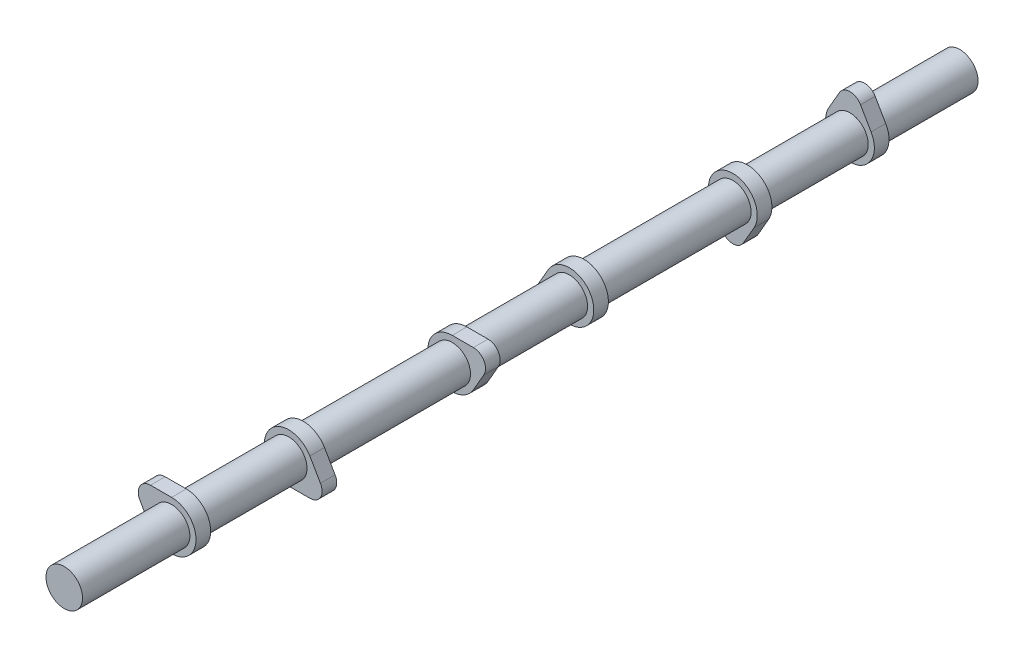
ISO-10303-21;
HEADER;
FILE_DESCRIPTION(('STEP AP214'),'2;1');
FILE_NAME('part.step','',(''),(''),'','','');
FILE_SCHEMA(('AUTOMOTIVE_DESIGN { 1 0 10303 214 1 1 1 1 }'));
ENDSEC;
DATA;
#1=APPLICATION_CONTEXT('core data for automotive mechanical design processes');
#2=APPLICATION_PROTOCOL_DEFINITION('international standard','automotive_design',2000,#1);
#3=PRODUCT_CONTEXT('',#1,'mechanical');
#4=PRODUCT('Part','Part','',(#3));
#5=PRODUCT_RELATED_PRODUCT_CATEGORY('part','',(#4));
#6=PRODUCT_DEFINITION_FORMATION('','',#4);
#7=PRODUCT_DEFINITION_CONTEXT('part definition',#1,'design');
#8=PRODUCT_DEFINITION('design','',#6,#7);
#9=PRODUCT_DEFINITION_SHAPE('','',#8);
#10=(LENGTH_UNIT() NAMED_UNIT(*) SI_UNIT(.MILLI.,.METRE.));
#11=(NAMED_UNIT(*) PLANE_ANGLE_UNIT() SI_UNIT($,.RADIAN.));
#12=(NAMED_UNIT(*) SI_UNIT($,.STERADIAN.) SOLID_ANGLE_UNIT());
#13=UNCERTAINTY_MEASURE_WITH_UNIT(LENGTH_MEASURE(1.E-05),#10,'distance_accuracy_value','');
#14=(GEOMETRIC_REPRESENTATION_CONTEXT(3) GLOBAL_UNCERTAINTY_ASSIGNED_CONTEXT((#13)) GLOBAL_UNIT_ASSIGNED_CONTEXT((#10,
#11,#12)) REPRESENTATION_CONTEXT('',''));
#15=CARTESIAN_POINT('',(0.,0.,0.));
#16=DIRECTION('',(0.,0.,1.));
#17=DIRECTION('',(1.,0.,0.));
#18=AXIS2_PLACEMENT_3D('',#15,#16,#17);
#19=CARTESIAN_POINT('',(0.,0.,412.75));
#20=DIRECTION('',(0.,0.,-1.));
#21=DIRECTION('',(-1.,0.,0.));
#22=AXIS2_PLACEMENT_3D('',#19,#20,#21);
#23=CYLINDRICAL_SURFACE('',#22,9.5);
#24=CARTESIAN_POINT('',(0.,0.,210.82));
#25=DIRECTION('',(0.,0.,1.));
#26=DIRECTION('',(1.,0.,0.));
#27=AXIS2_PLACEMENT_3D('',#24,#25,#26);
#28=CIRCLE('',#27,9.5);
#29=CARTESIAN_POINT('',(9.5,0.,210.82));
#30=VERTEX_POINT('',#29);
#31=EDGE_CURVE('E410',#30,#30,#28,.F.);
#32=ORIENTED_EDGE('',*,*,#31,.F.);
#33=EDGE_LOOP('',(#32));
#34=FACE_BOUND('',#33,.T.);
#35=CARTESIAN_POINT('',(0.,0.,288.29));
#36=DIRECTION('',(0.,0.,1.));
#37=DIRECTION('',(1.,0.,0.));
#38=AXIS2_PLACEMENT_3D('',#35,#36,#37);
#39=CIRCLE('',#38,9.5);
#40=CARTESIAN_POINT('',(9.5,0.,288.29));
#41=VERTEX_POINT('',#40);
#42=EDGE_CURVE('E236',#41,#41,#39,.F.);
#43=ORIENTED_EDGE('',*,*,#42,.T.);
#44=EDGE_LOOP('',(#43));
#45=FACE_BOUND('',#44,.T.);
#46=ADVANCED_FACE('F39',(#34,#45),#23,.T.);
#47=CARTESIAN_POINT('',(0.,0.,149.86));
#48=DIRECTION('',(0.,0.,1.));
#49=DIRECTION('',(1.,0.,0.));
#50=AXIS2_PLACEMENT_3D('',#47,#48,#49);
#51=CIRCLE('',#50,9.5);
#52=CARTESIAN_POINT('',(9.5,0.,149.86));
#53=VERTEX_POINT('',#52);
#54=EDGE_CURVE('E405',#53,#53,#51,.F.);
#55=ORIENTED_EDGE('',*,*,#54,.F.);
#56=EDGE_LOOP('',(#55));
#57=FACE_BOUND('',#56,.T.);
#58=CARTESIAN_POINT('',(0.,0.,203.2));
#59=DIRECTION('',(0.,0.,1.));
#60=DIRECTION('',(1.,0.,0.));
#61=AXIS2_PLACEMENT_3D('',#58,#59,#60);
#62=CIRCLE('',#61,9.5);
#63=CARTESIAN_POINT('',(9.5,0.,203.2));
#64=VERTEX_POINT('',#63);
#65=EDGE_CURVE('E304',#64,#64,#62,.F.);
#66=ORIENTED_EDGE('',*,*,#65,.T.);
#67=EDGE_LOOP('',(#66));
#68=FACE_BOUND('',#67,.T.);
#69=ADVANCED_FACE('F442',(#57,#68),#23,.T.);
#70=CARTESIAN_POINT('',(0.,0.,64.77));
#71=DIRECTION('',(0.,0.,1.));
#72=DIRECTION('',(1.,0.,0.));
#73=AXIS2_PLACEMENT_3D('',#70,#71,#72);
#74=CIRCLE('',#73,9.5);
#75=CARTESIAN_POINT('',(9.5,0.,64.77));
#76=VERTEX_POINT('',#75);
#77=EDGE_CURVE('E377',#76,#76,#74,.F.);
#78=ORIENTED_EDGE('',*,*,#77,.F.);
#79=EDGE_LOOP('',(#78));
#80=FACE_BOUND('',#79,.T.);
#81=CARTESIAN_POINT('',(0.,0.,142.24));
#82=DIRECTION('',(0.,0.,1.));
#83=DIRECTION('',(1.,0.,0.));
#84=AXIS2_PLACEMENT_3D('',#81,#82,#83);
#85=CIRCLE('',#84,9.5);
#86=CARTESIAN_POINT('',(9.5,0.,142.24));
#87=VERTEX_POINT('',#86);
#88=EDGE_CURVE('E335',#87,#87,#85,.F.);
#89=ORIENTED_EDGE('',*,*,#88,.T.);
#90=EDGE_LOOP('',(#89));
#91=FACE_BOUND('',#90,.T.);
#92=ADVANCED_FACE('F448',(#80,#91),#23,.T.);
#93=CARTESIAN_POINT('',(0.,0.,3.80999999999998));
#94=DIRECTION('',(0.,0.,1.));
#95=DIRECTION('',(1.,0.,0.));
#96=AXIS2_PLACEMENT_3D('',#93,#94,#95);
#97=CIRCLE('',#96,9.5);
#98=CARTESIAN_POINT('',(9.5,0.,3.80999999999998));
#99=VERTEX_POINT('',#98);
#100=EDGE_CURVE('E374',#99,#99,#97,.T.);
#101=ORIENTED_EDGE('',*,*,#100,.T.);
#102=EDGE_LOOP('',(#101));
#103=FACE_BOUND('',#102,.T.);
#104=CARTESIAN_POINT('',(0.,0.,57.15));
#105=DIRECTION('',(0.,0.,1.));
#106=DIRECTION('',(1.,0.,0.));
#107=AXIS2_PLACEMENT_3D('',#104,#105,#106);
#108=CIRCLE('',#107,9.5);
#109=CARTESIAN_POINT('',(9.5,0.,57.15));
#110=VERTEX_POINT('',#109);
#111=EDGE_CURVE('E366',#110,#110,#108,.F.);
#112=ORIENTED_EDGE('',*,*,#111,.T.);
#113=EDGE_LOOP('',(#112));
#114=FACE_BOUND('',#113,.T.);
#115=ADVANCED_FACE('F573',(#103,#114),#23,.T.);
#116=CARTESIAN_POINT('',(0.,12.7,3.81));
#117=DIRECTION('',(0.,0.,-1.));
#118=DIRECTION('',(-1.,0.,0.));
#119=AXIS2_PLACEMENT_3D('',#116,#117,#118);
#120=CYLINDRICAL_SURFACE('',#119,6.35);
#121=CARTESIAN_POINT('',(0.,12.7,-3.81));
#122=DIRECTION('',(0.,0.,1.));
#123=DIRECTION('',(1.,0.,0.));
#124=AXIS2_PLACEMENT_3D('',#121,#122,#123);
#125=CIRCLE('',#124,6.35);
#126=CARTESIAN_POINT('',(5.49926131403118,15.875,-3.81));
#127=VERTEX_POINT('',#126);
#128=CARTESIAN_POINT('',(-5.49926131403119,15.875,-3.81));
#129=VERTEX_POINT('',#128);
#130=EDGE_CURVE('E386',#127,#129,#125,.T.);
#131=ORIENTED_EDGE('',*,*,#130,.T.);
#132=DIRECTION('',(0.,0.,-1.));
#133=VECTOR('',#132,1.);
#134=CARTESIAN_POINT('',(-5.49926131403119,15.875,3.81));
#135=LINE('',#134,#133);
#136=CARTESIAN_POINT('',(-5.49926131403119,15.875,3.81));
#137=VERTEX_POINT('',#136);
#138=EDGE_CURVE('E378',#137,#129,#135,.T.);
#139=ORIENTED_EDGE('',*,*,#138,.F.);
#140=CARTESIAN_POINT('',(0.,12.7,3.81));
#141=DIRECTION('',(0.,0.,1.));
#142=DIRECTION('',(1.,0.,0.));
#143=AXIS2_PLACEMENT_3D('',#140,#141,#142);
#144=CIRCLE('',#143,6.35);
#145=CARTESIAN_POINT('',(5.49926131403118,15.875,3.81));
#146=VERTEX_POINT('',#145);
#147=EDGE_CURVE('E379',#146,#137,#144,.T.);
#148=ORIENTED_EDGE('',*,*,#147,.F.);
#149=DIRECTION('',(0.,0.,-1.));
#150=VECTOR('',#149,1.);
#151=CARTESIAN_POINT('',(5.49926131403118,15.875,3.81));
#152=LINE('',#151,#150);
#153=EDGE_CURVE('E385',#146,#127,#152,.T.);
#154=ORIENTED_EDGE('',*,*,#153,.T.);
#155=EDGE_LOOP('',(#131,#139,#148,#154));
#156=FACE_BOUND('',#155,.T.);
#157=ADVANCED_FACE('F41',(#156),#120,.T.);
#158=CARTESIAN_POINT('',(-5.49926131403119,15.875,3.81));
#159=DIRECTION('',(0.866025403784439,-0.5,0.));
#160=DIRECTION('',(0.5,0.866025403784439,0.));
#161=AXIS2_PLACEMENT_3D('',#158,#159,#160);
#162=PLANE('',#161);
#163=DIRECTION('',(-0.5,-0.866025403784439,0.));
#164=VECTOR('',#163,1.);
#165=CARTESIAN_POINT('',(-5.49926131403119,15.875,-3.81));
#166=LINE('',#165,#164);
#167=CARTESIAN_POINT('',(-10.9985226280624,6.35,-3.81));
#168=VERTEX_POINT('',#167);
#169=EDGE_CURVE('E389',#129,#168,#166,.T.);
#170=ORIENTED_EDGE('',*,*,#169,.T.);
#171=DIRECTION('',(0.,0.,-1.));
#172=VECTOR('',#171,1.);
#173=CARTESIAN_POINT('',(-10.9985226280624,6.35,3.81));
#174=LINE('',#173,#172);
#175=CARTESIAN_POINT('',(-10.9985226280624,6.35,3.81));
#176=VERTEX_POINT('',#175);
#177=EDGE_CURVE('E396',#176,#168,#174,.T.);
#178=ORIENTED_EDGE('',*,*,#177,.F.);
#179=DIRECTION('',(-0.5,-0.866025403784439,0.));
#180=VECTOR('',#179,1.);
#181=CARTESIAN_POINT('',(-5.49926131403119,15.875,3.81));
#182=LINE('',#181,#180);
#183=EDGE_CURVE('E88',#137,#176,#182,.T.);
#184=ORIENTED_EDGE('',*,*,#183,.F.);
#185=ORIENTED_EDGE('',*,*,#138,.T.);
#186=EDGE_LOOP('',(#170,#178,#184,#185));
#187=FACE_BOUND('',#186,.T.);
#188=ADVANCED_FACE('F599',(#187),#162,.F.);
#189=CARTESIAN_POINT('',(0.,0.,3.81));
#190=DIRECTION('',(0.,0.,-1.));
#191=DIRECTION('',(-1.,0.,0.));
#192=AXIS2_PLACEMENT_3D('',#189,#190,#191);
#193=CYLINDRICAL_SURFACE('',#192,12.7);
#194=CARTESIAN_POINT('',(0.,0.,-3.81));
#195=DIRECTION('',(0.,0.,1.));
#196=DIRECTION('',(1.,0.,0.));
#197=AXIS2_PLACEMENT_3D('',#194,#195,#196);
#198=CIRCLE('',#197,12.7);
#199=CARTESIAN_POINT('',(10.9985226280624,6.35,-3.81));
#200=VERTEX_POINT('',#199);
#201=EDGE_CURVE('E74',#168,#200,#198,.T.);
#202=ORIENTED_EDGE('',*,*,#201,.T.);
#203=DIRECTION('',(0.,0.,-1.));
#204=VECTOR('',#203,1.);
#205=CARTESIAN_POINT('',(10.9985226280624,6.35,3.81));
#206=LINE('',#205,#204);
#207=CARTESIAN_POINT('',(10.9985226280624,6.35,3.81));
#208=VERTEX_POINT('',#207);
#209=EDGE_CURVE('E394',#208,#200,#206,.T.);
#210=ORIENTED_EDGE('',*,*,#209,.F.);
#211=CARTESIAN_POINT('',(0.,0.,3.81));
#212=DIRECTION('',(0.,0.,1.));
#213=DIRECTION('',(1.,0.,0.));
#214=AXIS2_PLACEMENT_3D('',#211,#212,#213);
#215=CIRCLE('',#214,12.7);
#216=EDGE_CURVE('E382',#176,#208,#215,.T.);
#217=ORIENTED_EDGE('',*,*,#216,.F.);
#218=ORIENTED_EDGE('',*,*,#177,.T.);
#219=EDGE_LOOP('',(#202,#210,#217,#218));
#220=FACE_BOUND('',#219,.T.);
#221=ADVANCED_FACE('F614',(#220),#193,.T.);
#222=CARTESIAN_POINT('',(5.49926131403118,15.875,3.81));
#223=DIRECTION('',(-0.866025403784438,-0.5,0.));
#224=DIRECTION('',(0.5,-0.866025403784439,0.));
#225=AXIS2_PLACEMENT_3D('',#222,#223,#224);
#226=PLANE('',#225);
#227=DIRECTION('',(-0.5,0.866025403784439,0.));
#228=VECTOR('',#227,1.);
#229=CARTESIAN_POINT('',(5.49926131403118,15.875,-3.81));
#230=LINE('',#229,#228);
#231=EDGE_CURVE('E80',#200,#127,#230,.T.);
#232=ORIENTED_EDGE('',*,*,#231,.T.);
#233=ORIENTED_EDGE('',*,*,#153,.F.);
#234=DIRECTION('',(-0.5,0.866025403784439,0.));
#235=VECTOR('',#234,1.);
#236=CARTESIAN_POINT('',(5.49926131403118,15.875,3.81));
#237=LINE('',#236,#235);
#238=EDGE_CURVE('E56',#208,#146,#237,.T.);
#239=ORIENTED_EDGE('',*,*,#238,.F.);
#240=ORIENTED_EDGE('',*,*,#209,.T.);
#241=EDGE_LOOP('',(#232,#233,#239,#240));
#242=FACE_BOUND('',#241,.T.);
#243=ADVANCED_FACE('F608',(#242),#226,.F.);
#244=CARTESIAN_POINT('',(0.,12.7,3.81));
#245=DIRECTION('',(0.,0.,1.));
#246=DIRECTION('',(1.,0.,0.));
#247=AXIS2_PLACEMENT_3D('',#244,#245,#246);
#248=PLANE('',#247);
#249=ORIENTED_EDGE('',*,*,#100,.F.);
#250=EDGE_LOOP('',(#249));
#251=FACE_BOUND('',#250,.T.);
#252=ORIENTED_EDGE('',*,*,#147,.T.);
#253=ORIENTED_EDGE('',*,*,#183,.T.);
#254=ORIENTED_EDGE('',*,*,#216,.T.);
#255=ORIENTED_EDGE('',*,*,#238,.T.);
#256=EDGE_LOOP('',(#252,#253,#254,#255));
#257=FACE_BOUND('',#256,.T.);
#258=ADVANCED_FACE('F606',(#251,#257),#248,.T.);
#259=CARTESIAN_POINT('',(0.,12.7,-3.81));
#260=DIRECTION('',(0.,0.,1.));
#261=DIRECTION('',(1.,0.,0.));
#262=AXIS2_PLACEMENT_3D('',#259,#260,#261);
#263=PLANE('',#262);
#264=CARTESIAN_POINT('',(0.,0.,-3.80999999999998));
#265=DIRECTION('',(0.,0.,1.));
#266=DIRECTION('',(1.,0.,0.));
#267=AXIS2_PLACEMENT_3D('',#264,#265,#266);
#268=CIRCLE('',#267,9.5);
#269=CARTESIAN_POINT('',(9.5,0.,-3.80999999999998));
#270=VERTEX_POINT('',#269);
#271=EDGE_CURVE('E370',#270,#270,#268,.T.);
#272=ORIENTED_EDGE('',*,*,#271,.T.);
#273=EDGE_LOOP('',(#272));
#274=FACE_BOUND('',#273,.T.);
#275=ORIENTED_EDGE('',*,*,#130,.F.);
#276=ORIENTED_EDGE('',*,*,#231,.F.);
#277=ORIENTED_EDGE('',*,*,#201,.F.);
#278=ORIENTED_EDGE('',*,*,#169,.F.);
#279=EDGE_LOOP('',(#275,#276,#277,#278));
#280=FACE_BOUND('',#279,.T.);
#281=ADVANCED_FACE('F589',(#274,#280),#263,.F.);
#282=CARTESIAN_POINT('',(0.,0.,-53.34));
#283=DIRECTION('',(0.,0.,-1.));
#284=DIRECTION('',(-1.,0.,0.));
#285=AXIS2_PLACEMENT_3D('',#282,#283,#284);
#286=PLANE('',#285);
#287=CARTESIAN_POINT('',(0.,0.,-53.34));
#288=DIRECTION('',(0.,0.,-1.));
#289=DIRECTION('',(-1.,0.,0.));
#290=AXIS2_PLACEMENT_3D('',#287,#288,#289);
#291=CIRCLE('',#290,9.5);
#292=CARTESIAN_POINT('',(-9.5,0.,-53.34));
#293=VERTEX_POINT('',#292);
#294=EDGE_CURVE('E371',#293,#293,#291,.T.);
#295=ORIENTED_EDGE('',*,*,#294,.T.);
#296=EDGE_LOOP('',(#295));
#297=FACE_BOUND('',#296,.T.);
#298=ADVANCED_FACE('F571',(#297),#286,.T.);
#299=ORIENTED_EDGE('',*,*,#294,.F.);
#300=EDGE_LOOP('',(#299));
#301=FACE_BOUND('',#300,.T.);
#302=ORIENTED_EDGE('',*,*,#271,.F.);
#303=EDGE_LOOP('',(#302));
#304=FACE_BOUND('',#303,.T.);
#305=ADVANCED_FACE('F428',(#301,#304),#23,.T.);
#306=CARTESIAN_POINT('',(0.,-12.7,64.77));
#307=DIRECTION('',(0.,0.,-1.));
#308=DIRECTION('',(1.,0.,0.));
#309=AXIS2_PLACEMENT_3D('',#306,#307,#308);
#310=CYLINDRICAL_SURFACE('',#309,6.35);
#311=CARTESIAN_POINT('',(0.,-12.7,57.15));
#312=DIRECTION('',(0.,0.,1.));
#313=DIRECTION('',(-1.,0.,0.));
#314=AXIS2_PLACEMENT_3D('',#311,#312,#313);
#315=CIRCLE('',#314,6.35);
#316=CARTESIAN_POINT('',(-5.49926131403129,-15.875,57.15));
#317=VERTEX_POINT('',#316);
#318=CARTESIAN_POINT('',(5.49926131403107,-15.875,57.15));
#319=VERTEX_POINT('',#318);
#320=EDGE_CURVE('E347',#317,#319,#315,.T.);
#321=ORIENTED_EDGE('',*,*,#320,.T.);
#322=DIRECTION('',(0.,0.,-1.));
#323=VECTOR('',#322,1.);
#324=CARTESIAN_POINT('',(5.49926131403107,-15.875,64.77));
#325=LINE('',#324,#323);
#326=CARTESIAN_POINT('',(5.49926131403107,-15.875,64.77));
#327=VERTEX_POINT('',#326);
#328=EDGE_CURVE('E363',#327,#319,#325,.T.);
#329=ORIENTED_EDGE('',*,*,#328,.F.);
#330=CARTESIAN_POINT('',(0.,-12.7,64.77));
#331=DIRECTION('',(0.,0.,1.));
#332=DIRECTION('',(-1.,0.,0.));
#333=AXIS2_PLACEMENT_3D('',#330,#331,#332);
#334=CIRCLE('',#333,6.35);
#335=CARTESIAN_POINT('',(-5.49926131403129,-15.875,64.77));
#336=VERTEX_POINT('',#335);
#337=EDGE_CURVE('E336',#336,#327,#334,.T.);
#338=ORIENTED_EDGE('',*,*,#337,.F.);
#339=DIRECTION('',(0.,0.,-1.));
#340=VECTOR('',#339,1.);
#341=CARTESIAN_POINT('',(-5.49926131403129,-15.875,64.77));
#342=LINE('',#341,#340);
#343=EDGE_CURVE('E346',#336,#317,#342,.T.);
#344=ORIENTED_EDGE('',*,*,#343,.T.);
#345=EDGE_LOOP('',(#321,#329,#338,#344));
#346=FACE_BOUND('',#345,.T.);
#347=ADVANCED_FACE('F564',(#346),#310,.T.);
#348=CARTESIAN_POINT('',(5.49926131403107,-15.875,64.77));
#349=DIRECTION('',(-0.866025403784435,0.500000000000006,0.));
#350=DIRECTION('',(-0.500000000000006,-0.866025403784435,0.));
#351=AXIS2_PLACEMENT_3D('',#348,#349,#350);
#352=PLANE('',#351);
#353=DIRECTION('',(0.500000000000006,0.866025403784435,0.));
#354=VECTOR('',#353,1.);
#355=CARTESIAN_POINT('',(5.49926131403107,-15.875,57.15));
#356=LINE('',#355,#354);
#357=CARTESIAN_POINT('',(10.9985226280623,-6.35000000000008,57.15));
#358=VERTEX_POINT('',#357);
#359=EDGE_CURVE('E350',#319,#358,#356,.T.);
#360=ORIENTED_EDGE('',*,*,#359,.T.);
#361=DIRECTION('',(0.,0.,-1.));
#362=VECTOR('',#361,1.);
#363=CARTESIAN_POINT('',(10.9985226280623,-6.35000000000008,64.77));
#364=LINE('',#363,#362);
#365=CARTESIAN_POINT('',(10.9985226280623,-6.35000000000008,64.77));
#366=VERTEX_POINT('',#365);
#367=EDGE_CURVE('E360',#366,#358,#364,.T.);
#368=ORIENTED_EDGE('',*,*,#367,.F.);
#369=DIRECTION('',(0.500000000000006,0.866025403784435,0.));
#370=VECTOR('',#369,1.);
#371=CARTESIAN_POINT('',(5.49926131403107,-15.875,64.77));
#372=LINE('',#371,#370);
#373=EDGE_CURVE('E339',#327,#366,#372,.T.);
#374=ORIENTED_EDGE('',*,*,#373,.F.);
#375=ORIENTED_EDGE('',*,*,#328,.T.);
#376=EDGE_LOOP('',(#360,#368,#374,#375));
#377=FACE_BOUND('',#376,.T.);
#378=ADVANCED_FACE('F561',(#377),#352,.F.);
#379=CARTESIAN_POINT('',(0.,0.,64.77));
#380=DIRECTION('',(0.,0.,-1.));
#381=DIRECTION('',(1.,0.,0.));
#382=AXIS2_PLACEMENT_3D('',#379,#380,#381);
#383=CYLINDRICAL_SURFACE('',#382,12.7);
#384=CARTESIAN_POINT('',(0.,0.,57.15));
#385=DIRECTION('',(0.,0.,1.));
#386=DIRECTION('',(-1.,0.,0.));
#387=AXIS2_PLACEMENT_3D('',#384,#385,#386);
#388=CIRCLE('',#387,12.7);
#389=CARTESIAN_POINT('',(-10.9985226280624,-6.34999999999993,57.15));
#390=VERTEX_POINT('',#389);
#391=EDGE_CURVE('E352',#358,#390,#388,.T.);
#392=ORIENTED_EDGE('',*,*,#391,.T.);
#393=DIRECTION('',(0.,0.,-1.));
#394=VECTOR('',#393,1.);
#395=CARTESIAN_POINT('',(-10.9985226280624,-6.34999999999993,64.77));
#396=LINE('',#395,#394);
#397=CARTESIAN_POINT('',(-10.9985226280624,-6.34999999999993,64.77));
#398=VERTEX_POINT('',#397);
#399=EDGE_CURVE('E357',#398,#390,#396,.T.);
#400=ORIENTED_EDGE('',*,*,#399,.F.);
#401=CARTESIAN_POINT('',(0.,0.,64.77));
#402=DIRECTION('',(0.,0.,1.));
#403=DIRECTION('',(-1.,0.,0.));
#404=AXIS2_PLACEMENT_3D('',#401,#402,#403);
#405=CIRCLE('',#404,12.7);
#406=EDGE_CURVE('E342',#366,#398,#405,.T.);
#407=ORIENTED_EDGE('',*,*,#406,.F.);
#408=ORIENTED_EDGE('',*,*,#367,.T.);
#409=EDGE_LOOP('',(#392,#400,#407,#408));
#410=FACE_BOUND('',#409,.T.);
#411=ADVANCED_FACE('F557',(#410),#383,.T.);
#412=CARTESIAN_POINT('',(-5.49926131403129,-15.875,64.77));
#413=DIRECTION('',(0.866025403784442,0.499999999999994,0.));
#414=DIRECTION('',(-0.499999999999994,0.866025403784442,0.));
#415=AXIS2_PLACEMENT_3D('',#412,#413,#414);
#416=PLANE('',#415);
#417=DIRECTION('',(0.499999999999994,-0.866025403784442,0.));
#418=VECTOR('',#417,1.);
#419=CARTESIAN_POINT('',(-5.49926131403129,-15.875,57.15));
#420=LINE('',#419,#418);
#421=EDGE_CURVE('E340',#390,#317,#420,.T.);
#422=ORIENTED_EDGE('',*,*,#421,.T.);
#423=ORIENTED_EDGE('',*,*,#343,.F.);
#424=DIRECTION('',(0.499999999999994,-0.866025403784442,0.));
#425=VECTOR('',#424,1.);
#426=CARTESIAN_POINT('',(-5.49926131403129,-15.875,64.77));
#427=LINE('',#426,#425);
#428=EDGE_CURVE('E344',#398,#336,#427,.T.);
#429=ORIENTED_EDGE('',*,*,#428,.F.);
#430=ORIENTED_EDGE('',*,*,#399,.T.);
#431=EDGE_LOOP('',(#422,#423,#429,#430));
#432=FACE_BOUND('',#431,.T.);
#433=ADVANCED_FACE('F550',(#432),#416,.F.);
#434=CARTESIAN_POINT('',(0.,-12.7,64.77));
#435=DIRECTION('',(0.,0.,1.));
#436=DIRECTION('',(-1.,0.,0.));
#437=AXIS2_PLACEMENT_3D('',#434,#435,#436);
#438=PLANE('',#437);
#439=ORIENTED_EDGE('',*,*,#77,.T.);
#440=EDGE_LOOP('',(#439));
#441=FACE_BOUND('',#440,.T.);
#442=ORIENTED_EDGE('',*,*,#337,.T.);
#443=ORIENTED_EDGE('',*,*,#373,.T.);
#444=ORIENTED_EDGE('',*,*,#406,.T.);
#445=ORIENTED_EDGE('',*,*,#428,.T.);
#446=EDGE_LOOP('',(#442,#443,#444,#445));
#447=FACE_BOUND('',#446,.T.);
#448=ADVANCED_FACE('F547',(#441,#447),#438,.T.);
#449=CARTESIAN_POINT('',(0.,-12.7,57.15));
#450=DIRECTION('',(0.,0.,1.));
#451=DIRECTION('',(-1.,0.,0.));
#452=AXIS2_PLACEMENT_3D('',#449,#450,#451);
#453=PLANE('',#452);
#454=ORIENTED_EDGE('',*,*,#111,.F.);
#455=EDGE_LOOP('',(#454));
#456=FACE_BOUND('',#455,.T.);
#457=ORIENTED_EDGE('',*,*,#320,.F.);
#458=ORIENTED_EDGE('',*,*,#421,.F.);
#459=ORIENTED_EDGE('',*,*,#391,.F.);
#460=ORIENTED_EDGE('',*,*,#359,.F.);
#461=EDGE_LOOP('',(#457,#458,#459,#460));
#462=FACE_BOUND('',#461,.T.);
#463=ADVANCED_FACE('F545',(#456,#462),#453,.F.);
#464=CARTESIAN_POINT('',(-10.9985226280623,-6.35000000000005,149.86));
#465=DIRECTION('',(0.,0.,-1.));
#466=DIRECTION('',(0.500000000000004,-0.866025403784436,0.));
#467=AXIS2_PLACEMENT_3D('',#464,#465,#466);
#468=CYLINDRICAL_SURFACE('',#467,6.35);
#469=CARTESIAN_POINT('',(-10.9985226280623,-6.35000000000005,142.24));
#470=DIRECTION('',(0.,0.,1.));
#471=DIRECTION('',(-0.500000000000004,0.866025403784436,0.));
#472=AXIS2_PLACEMENT_3D('',#469,#470,#471);
#473=CIRCLE('',#472,6.35);
#474=CARTESIAN_POINT('',(-16.4977839420935,-3.17500000000008,142.24));
#475=VERTEX_POINT('',#474);
#476=CARTESIAN_POINT('',(-10.9985226280623,-12.7000000000001,142.24));
#477=VERTEX_POINT('',#476);
#478=EDGE_CURVE('E316',#475,#477,#473,.T.);
#479=ORIENTED_EDGE('',*,*,#478,.T.);
#480=DIRECTION('',(0.,0.,-1.));
#481=VECTOR('',#480,1.);
#482=CARTESIAN_POINT('',(-10.9985226280623,-12.7000000000001,149.86));
#483=LINE('',#482,#481);
#484=CARTESIAN_POINT('',(-10.9985226280623,-12.7000000000001,149.86));
#485=VERTEX_POINT('',#484);
#486=EDGE_CURVE('E332',#485,#477,#483,.T.);
#487=ORIENTED_EDGE('',*,*,#486,.F.);
#488=CARTESIAN_POINT('',(-10.9985226280623,-6.35000000000005,149.86));
#489=DIRECTION('',(0.,0.,1.));
#490=DIRECTION('',(-0.500000000000004,0.866025403784436,0.));
#491=AXIS2_PLACEMENT_3D('',#488,#489,#490);
#492=CIRCLE('',#491,6.35);
#493=CARTESIAN_POINT('',(-16.4977839420935,-3.17500000000008,149.86));
#494=VERTEX_POINT('',#493);
#495=EDGE_CURVE('E305',#494,#485,#492,.T.);
#496=ORIENTED_EDGE('',*,*,#495,.F.);
#497=DIRECTION('',(0.,0.,-1.));
#498=VECTOR('',#497,1.);
#499=CARTESIAN_POINT('',(-16.4977839420935,-3.17500000000008,149.86));
#500=LINE('',#499,#498);
#501=EDGE_CURVE('E315',#494,#475,#500,.T.);
#502=ORIENTED_EDGE('',*,*,#501,.T.);
#503=EDGE_LOOP('',(#479,#487,#496,#502));
#504=FACE_BOUND('',#503,.T.);
#505=ADVANCED_FACE('F541',(#504),#468,.T.);
#506=CARTESIAN_POINT('',(-10.9985226280623,-12.7000000000001,149.86));
#507=DIRECTION('',(0.,1.,0.));
#508=DIRECTION('',(-1.,0.,0.));
#509=AXIS2_PLACEMENT_3D('',#506,#507,#508);
#510=PLANE('',#509);
#511=DIRECTION('',(1.,0.,0.));
#512=VECTOR('',#511,1.);
#513=CARTESIAN_POINT('',(-10.9985226280623,-12.7000000000001,142.24));
#514=LINE('',#513,#512);
#515=CARTESIAN_POINT('',(0.,-12.7,142.24));
#516=VERTEX_POINT('',#515);
#517=EDGE_CURVE('E319',#477,#516,#514,.T.);
#518=ORIENTED_EDGE('',*,*,#517,.T.);
#519=DIRECTION('',(0.,0.,-1.));
#520=VECTOR('',#519,1.);
#521=CARTESIAN_POINT('',(0.,-12.7,149.86));
#522=LINE('',#521,#520);
#523=CARTESIAN_POINT('',(0.,-12.7,149.86));
#524=VERTEX_POINT('',#523);
#525=EDGE_CURVE('E329',#524,#516,#522,.T.);
#526=ORIENTED_EDGE('',*,*,#525,.F.);
#527=DIRECTION('',(1.,0.,0.));
#528=VECTOR('',#527,1.);
#529=CARTESIAN_POINT('',(-10.9985226280623,-12.7000000000001,149.86));
#530=LINE('',#529,#528);
#531=EDGE_CURVE('E308',#485,#524,#530,.T.);
#532=ORIENTED_EDGE('',*,*,#531,.F.);
#533=ORIENTED_EDGE('',*,*,#486,.T.);
#534=EDGE_LOOP('',(#518,#526,#532,#533));
#535=FACE_BOUND('',#534,.T.);
#536=ADVANCED_FACE('F537',(#535),#510,.F.);
#537=CARTESIAN_POINT('',(0.,0.,149.86));
#538=DIRECTION('',(0.,0.,-1.));
#539=DIRECTION('',(0.500000000000004,-0.866025403784436,0.));
#540=AXIS2_PLACEMENT_3D('',#537,#538,#539);
#541=CYLINDRICAL_SURFACE('',#540,12.7);
#542=CARTESIAN_POINT('',(0.,0.,142.24));
#543=DIRECTION('',(0.,0.,1.));
#544=DIRECTION('',(-0.500000000000004,0.866025403784436,0.));
#545=AXIS2_PLACEMENT_3D('',#542,#543,#544);
#546=CIRCLE('',#545,12.7);
#547=CARTESIAN_POINT('',(-10.9985226280624,6.34999999999995,142.24));
#548=VERTEX_POINT('',#547);
#549=EDGE_CURVE('E321',#516,#548,#546,.T.);
#550=ORIENTED_EDGE('',*,*,#549,.T.);
#551=DIRECTION('',(0.,0.,-1.));
#552=VECTOR('',#551,1.);
#553=CARTESIAN_POINT('',(-10.9985226280624,6.34999999999995,149.86));
#554=LINE('',#553,#552);
#555=CARTESIAN_POINT('',(-10.9985226280624,6.34999999999995,149.86));
#556=VERTEX_POINT('',#555);
#557=EDGE_CURVE('E326',#556,#548,#554,.T.);
#558=ORIENTED_EDGE('',*,*,#557,.F.);
#559=CARTESIAN_POINT('',(0.,0.,149.86));
#560=DIRECTION('',(0.,0.,1.));
#561=DIRECTION('',(-0.500000000000004,0.866025403784436,0.));
#562=AXIS2_PLACEMENT_3D('',#559,#560,#561);
#563=CIRCLE('',#562,12.7);
#564=EDGE_CURVE('E311',#524,#556,#563,.T.);
#565=ORIENTED_EDGE('',*,*,#564,.F.);
#566=ORIENTED_EDGE('',*,*,#525,.T.);
#567=EDGE_LOOP('',(#550,#558,#565,#566));
#568=FACE_BOUND('',#567,.T.);
#569=ADVANCED_FACE('F533',(#568),#541,.T.);
#570=CARTESIAN_POINT('',(-16.4977839420935,-3.17500000000008,149.86));
#571=DIRECTION('',(0.866025403784441,-0.499999999999996,0.));
#572=DIRECTION('',(0.499999999999996,0.866025403784441,0.));
#573=AXIS2_PLACEMENT_3D('',#570,#571,#572);
#574=PLANE('',#573);
#575=DIRECTION('',(-0.499999999999996,-0.866025403784441,0.));
#576=VECTOR('',#575,1.);
#577=CARTESIAN_POINT('',(-16.4977839420935,-3.17500000000008,142.24));
#578=LINE('',#577,#576);
#579=EDGE_CURVE('E309',#548,#475,#578,.T.);
#580=ORIENTED_EDGE('',*,*,#579,.T.);
#581=ORIENTED_EDGE('',*,*,#501,.F.);
#582=DIRECTION('',(-0.499999999999996,-0.866025403784441,0.));
#583=VECTOR('',#582,1.);
#584=CARTESIAN_POINT('',(-16.4977839420935,-3.17500000000008,149.86));
#585=LINE('',#584,#583);
#586=EDGE_CURVE('E313',#556,#494,#585,.T.);
#587=ORIENTED_EDGE('',*,*,#586,.F.);
#588=ORIENTED_EDGE('',*,*,#557,.T.);
#589=EDGE_LOOP('',(#580,#581,#587,#588));
#590=FACE_BOUND('',#589,.T.);
#591=ADVANCED_FACE('F526',(#590),#574,.F.);
#592=CARTESIAN_POINT('',(-10.9985226280623,-6.35000000000005,149.86));
#593=DIRECTION('',(0.,0.,1.));
#594=DIRECTION('',(-0.500000000000004,0.866025403784436,0.));
#595=AXIS2_PLACEMENT_3D('',#592,#593,#594);
#596=PLANE('',#595);
#597=ORIENTED_EDGE('',*,*,#54,.T.);
#598=EDGE_LOOP('',(#597));
#599=FACE_BOUND('',#598,.T.);
#600=ORIENTED_EDGE('',*,*,#495,.T.);
#601=ORIENTED_EDGE('',*,*,#531,.T.);
#602=ORIENTED_EDGE('',*,*,#564,.T.);
#603=ORIENTED_EDGE('',*,*,#586,.T.);
#604=EDGE_LOOP('',(#600,#601,#602,#603));
#605=FACE_BOUND('',#604,.T.);
#606=ADVANCED_FACE('F523',(#599,#605),#596,.T.);
#607=CARTESIAN_POINT('',(-10.9985226280623,-6.35000000000005,142.24));
#608=DIRECTION('',(0.,0.,1.));
#609=DIRECTION('',(-0.500000000000004,0.866025403784436,0.));
#610=AXIS2_PLACEMENT_3D('',#607,#608,#609);
#611=PLANE('',#610);
#612=ORIENTED_EDGE('',*,*,#88,.F.);
#613=EDGE_LOOP('',(#612));
#614=FACE_BOUND('',#613,.T.);
#615=ORIENTED_EDGE('',*,*,#478,.F.);
#616=ORIENTED_EDGE('',*,*,#579,.F.);
#617=ORIENTED_EDGE('',*,*,#549,.F.);
#618=ORIENTED_EDGE('',*,*,#517,.F.);
#619=EDGE_LOOP('',(#615,#616,#617,#618));
#620=FACE_BOUND('',#619,.T.);
#621=ADVANCED_FACE('F521',(#614,#620),#611,.F.);
#622=CARTESIAN_POINT('',(10.9985226280624,6.34999999999997,210.82));
#623=DIRECTION('',(0.,0.,-1.));
#624=DIRECTION('',(-0.499999999999998,0.86602540378444,0.));
#625=AXIS2_PLACEMENT_3D('',#622,#623,#624);
#626=CYLINDRICAL_SURFACE('',#625,6.35);
#627=CARTESIAN_POINT('',(10.9985226280624,6.34999999999997,203.2));
#628=DIRECTION('',(0.,0.,1.));
#629=DIRECTION('',(0.499999999999998,-0.86602540378444,0.));
#630=AXIS2_PLACEMENT_3D('',#627,#628,#629);
#631=CIRCLE('',#630,6.35);
#632=CARTESIAN_POINT('',(16.4977839420936,3.17499999999996,203.2));
#633=VERTEX_POINT('',#632);
#634=CARTESIAN_POINT('',(10.9985226280624,12.7,203.2));
#635=VERTEX_POINT('',#634);
#636=EDGE_CURVE('E285',#633,#635,#631,.T.);
#637=ORIENTED_EDGE('',*,*,#636,.T.);
#638=DIRECTION('',(0.,0.,-1.));
#639=VECTOR('',#638,1.);
#640=CARTESIAN_POINT('',(10.9985226280624,12.7,210.82));
#641=LINE('',#640,#639);
#642=CARTESIAN_POINT('',(10.9985226280624,12.7,210.82));
#643=VERTEX_POINT('',#642);
#644=EDGE_CURVE('E301',#643,#635,#641,.T.);
#645=ORIENTED_EDGE('',*,*,#644,.F.);
#646=CARTESIAN_POINT('',(10.9985226280624,6.34999999999997,210.82));
#647=DIRECTION('',(0.,0.,1.));
#648=DIRECTION('',(0.499999999999998,-0.86602540378444,0.));
#649=AXIS2_PLACEMENT_3D('',#646,#647,#648);
#650=CIRCLE('',#649,6.35);
#651=CARTESIAN_POINT('',(16.4977839420936,3.17499999999996,210.82));
#652=VERTEX_POINT('',#651);
#653=EDGE_CURVE('E274',#652,#643,#650,.T.);
#654=ORIENTED_EDGE('',*,*,#653,.F.);
#655=DIRECTION('',(0.,0.,-1.));
#656=VECTOR('',#655,1.);
#657=CARTESIAN_POINT('',(16.4977839420936,3.17499999999996,210.82));
#658=LINE('',#657,#656);
#659=EDGE_CURVE('E284',#652,#633,#658,.T.);
#660=ORIENTED_EDGE('',*,*,#659,.T.);
#661=EDGE_LOOP('',(#637,#645,#654,#660));
#662=FACE_BOUND('',#661,.T.);
#663=ADVANCED_FACE('F517',(#662),#626,.T.);
#664=CARTESIAN_POINT('',(10.9985226280624,12.7,210.82));
#665=DIRECTION('',(0.,-1.,0.));
#666=DIRECTION('',(1.,0.,0.));
#667=AXIS2_PLACEMENT_3D('',#664,#665,#666);
#668=PLANE('',#667);
#669=DIRECTION('',(-1.,0.,0.));
#670=VECTOR('',#669,1.);
#671=CARTESIAN_POINT('',(10.9985226280624,12.7,203.2));
#672=LINE('',#671,#670);
#673=CARTESIAN_POINT('',(0.,12.7,203.2));
#674=VERTEX_POINT('',#673);
#675=EDGE_CURVE('E288',#635,#674,#672,.T.);
#676=ORIENTED_EDGE('',*,*,#675,.T.);
#677=DIRECTION('',(0.,0.,-1.));
#678=VECTOR('',#677,1.);
#679=CARTESIAN_POINT('',(0.,12.7,210.82));
#680=LINE('',#679,#678);
#681=CARTESIAN_POINT('',(0.,12.7,210.82));
#682=VERTEX_POINT('',#681);
#683=EDGE_CURVE('E298',#682,#674,#680,.T.);
#684=ORIENTED_EDGE('',*,*,#683,.F.);
#685=DIRECTION('',(-1.,0.,0.));
#686=VECTOR('',#685,1.);
#687=CARTESIAN_POINT('',(10.9985226280624,12.7,210.82));
#688=LINE('',#687,#686);
#689=EDGE_CURVE('E277',#643,#682,#688,.T.);
#690=ORIENTED_EDGE('',*,*,#689,.F.);
#691=ORIENTED_EDGE('',*,*,#644,.T.);
#692=EDGE_LOOP('',(#676,#684,#690,#691));
#693=FACE_BOUND('',#692,.T.);
#694=ADVANCED_FACE('F513',(#693),#668,.F.);
#695=CARTESIAN_POINT('',(0.,0.,210.82));
#696=DIRECTION('',(0.,0.,-1.));
#697=DIRECTION('',(-0.499999999999998,0.86602540378444,0.));
#698=AXIS2_PLACEMENT_3D('',#695,#696,#697);
#699=CYLINDRICAL_SURFACE('',#698,12.7);
#700=CARTESIAN_POINT('',(0.,0.,203.2));
#701=DIRECTION('',(0.,0.,1.));
#702=DIRECTION('',(0.499999999999998,-0.86602540378444,0.));
#703=AXIS2_PLACEMENT_3D('',#700,#701,#702);
#704=CIRCLE('',#703,12.7);
#705=CARTESIAN_POINT('',(10.9985226280624,-6.35000000000002,203.2));
#706=VERTEX_POINT('',#705);
#707=EDGE_CURVE('E290',#674,#706,#704,.T.);
#708=ORIENTED_EDGE('',*,*,#707,.T.);
#709=DIRECTION('',(0.,0.,-1.));
#710=VECTOR('',#709,1.);
#711=CARTESIAN_POINT('',(10.9985226280624,-6.35000000000002,210.82));
#712=LINE('',#711,#710);
#713=CARTESIAN_POINT('',(10.9985226280624,-6.35000000000002,210.82));
#714=VERTEX_POINT('',#713);
#715=EDGE_CURVE('E295',#714,#706,#712,.T.);
#716=ORIENTED_EDGE('',*,*,#715,.F.);
#717=CARTESIAN_POINT('',(0.,0.,210.82));
#718=DIRECTION('',(0.,0.,1.));
#719=DIRECTION('',(0.499999999999998,-0.86602540378444,0.));
#720=AXIS2_PLACEMENT_3D('',#717,#718,#719);
#721=CIRCLE('',#720,12.7);
#722=EDGE_CURVE('E280',#682,#714,#721,.T.);
#723=ORIENTED_EDGE('',*,*,#722,.F.);
#724=ORIENTED_EDGE('',*,*,#683,.T.);
#725=EDGE_LOOP('',(#708,#716,#723,#724));
#726=FACE_BOUND('',#725,.T.);
#727=ADVANCED_FACE('F509',(#726),#699,.T.);
#728=CARTESIAN_POINT('',(16.4977839420936,3.17499999999996,210.82));
#729=DIRECTION('',(-0.866025403784437,0.500000000000002,0.));
#730=DIRECTION('',(-0.500000000000002,-0.866025403784438,0.));
#731=AXIS2_PLACEMENT_3D('',#728,#729,#730);
#732=PLANE('',#731);
#733=DIRECTION('',(0.500000000000002,0.866025403784438,0.));
#734=VECTOR('',#733,1.);
#735=CARTESIAN_POINT('',(16.4977839420936,3.17499999999996,203.2));
#736=LINE('',#735,#734);
#737=EDGE_CURVE('E278',#706,#633,#736,.T.);
#738=ORIENTED_EDGE('',*,*,#737,.T.);
#739=ORIENTED_EDGE('',*,*,#659,.F.);
#740=DIRECTION('',(0.500000000000002,0.866025403784438,0.));
#741=VECTOR('',#740,1.);
#742=CARTESIAN_POINT('',(16.4977839420936,3.17499999999996,210.82));
#743=LINE('',#742,#741);
#744=EDGE_CURVE('E282',#714,#652,#743,.T.);
#745=ORIENTED_EDGE('',*,*,#744,.F.);
#746=ORIENTED_EDGE('',*,*,#715,.T.);
#747=EDGE_LOOP('',(#738,#739,#745,#746));
#748=FACE_BOUND('',#747,.T.);
#749=ADVANCED_FACE('F502',(#748),#732,.F.);
#750=CARTESIAN_POINT('',(10.9985226280624,6.34999999999997,210.82));
#751=DIRECTION('',(0.,0.,1.));
#752=DIRECTION('',(0.499999999999998,-0.86602540378444,0.));
#753=AXIS2_PLACEMENT_3D('',#750,#751,#752);
#754=PLANE('',#753);
#755=ORIENTED_EDGE('',*,*,#31,.T.);
#756=EDGE_LOOP('',(#755));
#757=FACE_BOUND('',#756,.T.);
#758=ORIENTED_EDGE('',*,*,#653,.T.);
#759=ORIENTED_EDGE('',*,*,#689,.T.);
#760=ORIENTED_EDGE('',*,*,#722,.T.);
#761=ORIENTED_EDGE('',*,*,#744,.T.);
#762=EDGE_LOOP('',(#758,#759,#760,#761));
#763=FACE_BOUND('',#762,.T.);
#764=ADVANCED_FACE('F498',(#757,#763),#754,.T.);
#765=CARTESIAN_POINT('',(10.9985226280624,6.34999999999997,203.2));
#766=DIRECTION('',(0.,0.,1.));
#767=DIRECTION('',(0.499999999999998,-0.86602540378444,0.));
#768=AXIS2_PLACEMENT_3D('',#765,#766,#767);
#769=PLANE('',#768);
#770=ORIENTED_EDGE('',*,*,#65,.F.);
#771=EDGE_LOOP('',(#770));
#772=FACE_BOUND('',#771,.T.);
#773=ORIENTED_EDGE('',*,*,#636,.F.);
#774=ORIENTED_EDGE('',*,*,#737,.F.);
#775=ORIENTED_EDGE('',*,*,#707,.F.);
#776=ORIENTED_EDGE('',*,*,#675,.F.);
#777=EDGE_LOOP('',(#773,#774,#775,#776));
#778=FACE_BOUND('',#777,.T.);
#779=ADVANCED_FACE('F501',(#772,#778),#769,.F.);
#780=CARTESIAN_POINT('',(10.9985226280624,-6.3499999999999,295.91));
#781=DIRECTION('',(0.,0.,-1.));
#782=DIRECTION('',(0.499999999999992,0.866025403784443,0.));
#783=AXIS2_PLACEMENT_3D('',#780,#781,#782);
#784=CYLINDRICAL_SURFACE('',#783,6.35);
#785=CARTESIAN_POINT('',(10.9985226280624,-6.3499999999999,288.29));
#786=DIRECTION('',(0.,0.,1.));
#787=DIRECTION('',(-0.499999999999992,-0.866025403784443,0.));
#788=AXIS2_PLACEMENT_3D('',#785,#786,#787);
#789=CIRCLE('',#788,6.35);
#790=CARTESIAN_POINT('',(10.9985226280625,-12.6999999999999,288.29));
#791=VERTEX_POINT('',#790);
#792=CARTESIAN_POINT('',(16.4977839420936,-3.17499999999985,288.29));
#793=VERTEX_POINT('',#792);
#794=EDGE_CURVE('E235',#791,#793,#789,.T.);
#795=ORIENTED_EDGE('',*,*,#794,.T.);
#796=DIRECTION('',(0.,0.,-1.));
#797=VECTOR('',#796,1.);
#798=CARTESIAN_POINT('',(16.4977839420936,-3.17499999999985,295.91));
#799=LINE('',#798,#797);
#800=CARTESIAN_POINT('',(16.4977839420936,-3.17499999999985,295.91));
#801=VERTEX_POINT('',#800);
#802=EDGE_CURVE('E215',#801,#793,#799,.T.);
#803=ORIENTED_EDGE('',*,*,#802,.F.);
#804=CARTESIAN_POINT('',(10.9985226280624,-6.3499999999999,295.91));
#805=DIRECTION('',(0.,0.,1.));
#806=DIRECTION('',(-0.499999999999992,-0.866025403784443,0.));
#807=AXIS2_PLACEMENT_3D('',#804,#805,#806);
#808=CIRCLE('',#807,6.35);
#809=CARTESIAN_POINT('',(10.9985226280625,-12.6999999999999,295.91));
#810=VERTEX_POINT('',#809);
#811=EDGE_CURVE('E222',#810,#801,#808,.T.);
#812=ORIENTED_EDGE('',*,*,#811,.F.);
#813=DIRECTION('',(0.,0.,-1.));
#814=VECTOR('',#813,1.);
#815=CARTESIAN_POINT('',(10.9985226280625,-12.6999999999999,295.91));
#816=LINE('',#815,#814);
#817=EDGE_CURVE('E984',#810,#791,#816,.T.);
#818=ORIENTED_EDGE('',*,*,#817,.T.);
#819=EDGE_LOOP('',(#795,#803,#812,#818));
#820=FACE_BOUND('',#819,.T.);
#821=ADVANCED_FACE('F233',(#820),#784,.T.);
#822=CARTESIAN_POINT('',(16.4977839420936,-3.17499999999985,295.91));
#823=DIRECTION('',(-0.866025403784434,-0.500000000000008,0.));
#824=DIRECTION('',(0.500000000000008,-0.866025403784434,0.));
#825=AXIS2_PLACEMENT_3D('',#822,#823,#824);
#826=PLANE('',#825);
#827=DIRECTION('',(-0.500000000000008,0.866025403784434,0.));
#828=VECTOR('',#827,1.);
#829=CARTESIAN_POINT('',(16.4977839420936,-3.17499999999985,288.29));
#830=LINE('',#829,#828);
#831=CARTESIAN_POINT('',(10.9985226280623,6.3500000000001,288.29));
#832=VERTEX_POINT('',#831);
#833=EDGE_CURVE('E991',#793,#832,#830,.T.);
#834=ORIENTED_EDGE('',*,*,#833,.T.);
#835=DIRECTION('',(0.,0.,-1.));
#836=VECTOR('',#835,1.);
#837=CARTESIAN_POINT('',(10.9985226280623,6.3500000000001,295.91));
#838=LINE('',#837,#836);
#839=CARTESIAN_POINT('',(10.9985226280623,6.3500000000001,295.91));
#840=VERTEX_POINT('',#839);
#841=EDGE_CURVE('E218',#840,#832,#838,.T.);
#842=ORIENTED_EDGE('',*,*,#841,.F.);
#843=DIRECTION('',(-0.500000000000008,0.866025403784434,0.));
#844=VECTOR('',#843,1.);
#845=CARTESIAN_POINT('',(16.4977839420936,-3.17499999999985,295.91));
#846=LINE('',#845,#844);
#847=EDGE_CURVE('E211',#801,#840,#846,.T.);
#848=ORIENTED_EDGE('',*,*,#847,.F.);
#849=ORIENTED_EDGE('',*,*,#802,.T.);
#850=EDGE_LOOP('',(#834,#842,#848,#849));
#851=FACE_BOUND('',#850,.T.);
#852=ADVANCED_FACE('F213',(#851),#826,.F.);
#853=CARTESIAN_POINT('',(0.,0.,295.91));
#854=DIRECTION('',(0.,0.,-1.));
#855=DIRECTION('',(0.499999999999992,0.866025403784443,0.));
#856=AXIS2_PLACEMENT_3D('',#853,#854,#855);
#857=CYLINDRICAL_SURFACE('',#856,12.7);
#858=CARTESIAN_POINT('',(0.,0.,288.29));
#859=DIRECTION('',(0.,0.,1.));
#860=DIRECTION('',(-0.499999999999992,-0.866025403784443,0.));
#861=AXIS2_PLACEMENT_3D('',#858,#859,#860);
#862=CIRCLE('',#861,12.7);
#863=CARTESIAN_POINT('',(1.21430643318376E-13,-12.7,288.29));
#864=VERTEX_POINT('',#863);
#865=EDGE_CURVE('E988',#832,#864,#862,.T.);
#866=ORIENTED_EDGE('',*,*,#865,.T.);
#867=DIRECTION('',(0.,0.,-1.));
#868=VECTOR('',#867,1.);
#869=CARTESIAN_POINT('',(1.21430643318376E-13,-12.7,295.91));
#870=LINE('',#869,#868);
#871=CARTESIAN_POINT('',(1.21430643318376E-13,-12.7,295.91));
#872=VERTEX_POINT('',#871);
#873=EDGE_CURVE('E240',#872,#864,#870,.T.);
#874=ORIENTED_EDGE('',*,*,#873,.F.);
#875=CARTESIAN_POINT('',(0.,0.,295.91));
#876=DIRECTION('',(0.,0.,1.));
#877=DIRECTION('',(-0.499999999999992,-0.866025403784443,0.));
#878=AXIS2_PLACEMENT_3D('',#875,#876,#877);
#879=CIRCLE('',#878,12.7);
#880=EDGE_CURVE('E221',#840,#872,#879,.T.);
#881=ORIENTED_EDGE('',*,*,#880,.F.);
#882=ORIENTED_EDGE('',*,*,#841,.T.);
#883=EDGE_LOOP('',(#866,#874,#881,#882));
#884=FACE_BOUND('',#883,.T.);
#885=ADVANCED_FACE('F806',(#884),#857,.T.);
#886=CARTESIAN_POINT('',(10.9985226280625,-12.6999999999999,295.91));
#887=DIRECTION('',(0.,1.,0.));
#888=DIRECTION('',(-1.,0.,0.));
#889=AXIS2_PLACEMENT_3D('',#886,#887,#888);
#890=PLANE('',#889);
#891=DIRECTION('',(1.,0.,0.));
#892=VECTOR('',#891,1.);
#893=CARTESIAN_POINT('',(10.9985226280625,-12.6999999999999,288.29));
#894=LINE('',#893,#892);
#895=EDGE_CURVE('E231',#864,#791,#894,.T.);
#896=ORIENTED_EDGE('',*,*,#895,.T.);
#897=ORIENTED_EDGE('',*,*,#817,.F.);
#898=DIRECTION('',(1.,0.,0.));
#899=VECTOR('',#898,1.);
#900=CARTESIAN_POINT('',(10.9985226280625,-12.6999999999999,295.91));
#901=LINE('',#900,#899);
#902=EDGE_CURVE('E227',#872,#810,#901,.T.);
#903=ORIENTED_EDGE('',*,*,#902,.F.);
#904=ORIENTED_EDGE('',*,*,#873,.T.);
#905=EDGE_LOOP('',(#896,#897,#903,#904));
#906=FACE_BOUND('',#905,.T.);
#907=ADVANCED_FACE('F815',(#906),#890,.F.);
#908=CARTESIAN_POINT('',(10.9985226280624,-6.3499999999999,295.91));
#909=DIRECTION('',(0.,0.,1.));
#910=DIRECTION('',(-0.499999999999992,-0.866025403784443,0.));
#911=AXIS2_PLACEMENT_3D('',#908,#909,#910);
#912=PLANE('',#911);
#913=CARTESIAN_POINT('',(0.,0.,295.91));
#914=DIRECTION('',(0.,0.,1.));
#915=DIRECTION('',(1.,0.,0.));
#916=AXIS2_PLACEMENT_3D('',#913,#914,#915);
#917=CIRCLE('',#916,9.5);
#918=CARTESIAN_POINT('',(9.5,0.,295.91));
#919=VERTEX_POINT('',#918);
#920=EDGE_CURVE('E11',#919,#919,#917,.F.);
#921=ORIENTED_EDGE('',*,*,#920,.T.);
#922=EDGE_LOOP('',(#921));
#923=FACE_BOUND('',#922,.T.);
#924=ORIENTED_EDGE('',*,*,#811,.T.);
#925=ORIENTED_EDGE('',*,*,#847,.T.);
#926=ORIENTED_EDGE('',*,*,#880,.T.);
#927=ORIENTED_EDGE('',*,*,#902,.T.);
#928=EDGE_LOOP('',(#924,#925,#926,#927));
#929=FACE_BOUND('',#928,.T.);
#930=ADVANCED_FACE('F225',(#923,#929),#912,.T.);
#931=CARTESIAN_POINT('',(10.9985226280624,-6.3499999999999,288.29));
#932=DIRECTION('',(0.,0.,1.));
#933=DIRECTION('',(-0.499999999999992,-0.866025403784443,0.));
#934=AXIS2_PLACEMENT_3D('',#931,#932,#933);
#935=PLANE('',#934);
#936=ORIENTED_EDGE('',*,*,#42,.F.);
#937=EDGE_LOOP('',(#936));
#938=FACE_BOUND('',#937,.T.);
#939=ORIENTED_EDGE('',*,*,#794,.F.);
#940=ORIENTED_EDGE('',*,*,#895,.F.);
#941=ORIENTED_EDGE('',*,*,#865,.F.);
#942=ORIENTED_EDGE('',*,*,#833,.F.);
#943=EDGE_LOOP('',(#939,#940,#941,#942));
#944=FACE_BOUND('',#943,.T.);
#945=ADVANCED_FACE('F432',(#938,#944),#935,.F.);
#946=CARTESIAN_POINT('',(0.,0.,412.75));
#947=DIRECTION('',(0.,0.,-1.));
#948=DIRECTION('',(-1.,0.,0.));
#949=AXIS2_PLACEMENT_3D('',#946,#947,#948);
#950=PLANE('',#949);
#951=CARTESIAN_POINT('',(0.,0.,412.75));
#952=DIRECTION('',(0.,0.,-1.));
#953=DIRECTION('',(-1.,0.,0.));
#954=AXIS2_PLACEMENT_3D('',#951,#952,#953);
#955=CIRCLE('',#954,9.5);
#956=CARTESIAN_POINT('',(-9.5,0.,412.75));
#957=VERTEX_POINT('',#956);
#958=EDGE_CURVE('E367',#957,#957,#955,.T.);
#959=ORIENTED_EDGE('',*,*,#958,.F.);
#960=EDGE_LOOP('',(#959));
#961=FACE_BOUND('',#960,.T.);
#962=ADVANCED_FACE('F426',(#961),#950,.F.);
#963=CARTESIAN_POINT('',(0.,0.,356.87));
#964=DIRECTION('',(0.,0.,1.));
#965=DIRECTION('',(1.,0.,0.));
#966=AXIS2_PLACEMENT_3D('',#963,#964,#965);
#967=CIRCLE('',#966,9.5);
#968=CARTESIAN_POINT('',(9.5,0.,356.87));
#969=VERTEX_POINT('',#968);
#970=EDGE_CURVE('E48',#969,#969,#967,.F.);
#971=ORIENTED_EDGE('',*,*,#970,.F.);
#972=EDGE_LOOP('',(#971));
#973=FACE_BOUND('',#972,.T.);
#974=ORIENTED_EDGE('',*,*,#958,.T.);
#975=EDGE_LOOP('',(#974));
#976=FACE_BOUND('',#975,.T.);
#977=ADVANCED_FACE('F423',(#973,#976),#23,.T.);
#978=CARTESIAN_POINT('',(-10.9985226280624,6.34999999999997,356.87));
#979=DIRECTION('',(0.,0.,1.));
#980=DIRECTION('',(0.499999999999998,0.86602540378444,0.));
#981=AXIS2_PLACEMENT_3D('',#978,#979,#980);
#982=PLANE('',#981);
#983=ORIENTED_EDGE('',*,*,#970,.T.);
#984=EDGE_LOOP('',(#983));
#985=FACE_BOUND('',#984,.T.);
#986=CARTESIAN_POINT('',(-10.9985226280624,6.34999999999997,356.87));
#987=DIRECTION('',(0.,0.,1.));
#988=DIRECTION('',(0.499999999999998,0.86602540378444,0.));
#989=AXIS2_PLACEMENT_3D('',#986,#987,#988);
#990=CIRCLE('',#989,6.35);
#991=CARTESIAN_POINT('',(-10.9985226280624,12.7,356.87));
#992=VERTEX_POINT('',#991);
#993=CARTESIAN_POINT('',(-16.4977839420936,3.17499999999996,356.87));
#994=VERTEX_POINT('',#993);
#995=EDGE_CURVE('E244',#992,#994,#990,.T.);
#996=ORIENTED_EDGE('',*,*,#995,.T.);
#997=DIRECTION('',(0.500000000000002,-0.866025403784437,0.));
#998=VECTOR('',#997,1.);
#999=CARTESIAN_POINT('',(-16.4977839420936,3.17499999999996,356.87));
#1000=LINE('',#999,#998);
#1001=CARTESIAN_POINT('',(-10.9985226280624,-6.35000000000002,356.87));
#1002=VERTEX_POINT('',#1001);
#1003=EDGE_CURVE('E247',#994,#1002,#1000,.T.);
#1004=ORIENTED_EDGE('',*,*,#1003,.T.);
#1005=CARTESIAN_POINT('',(0.,0.,356.87));
#1006=DIRECTION('',(0.,0.,1.));
#1007=DIRECTION('',(0.499999999999998,0.86602540378444,0.));
#1008=AXIS2_PLACEMENT_3D('',#1005,#1006,#1007);
#1009=CIRCLE('',#1008,12.7);
#1010=CARTESIAN_POINT('',(0.,12.7,356.87));
#1011=VERTEX_POINT('',#1010);
#1012=EDGE_CURVE('E250',#1002,#1011,#1009,.T.);
#1013=ORIENTED_EDGE('',*,*,#1012,.T.);
#1014=DIRECTION('',(-1.,0.,0.));
#1015=VECTOR('',#1014,1.);
#1016=CARTESIAN_POINT('',(-10.9985226280624,12.7,356.87));
#1017=LINE('',#1016,#1015);
#1018=EDGE_CURVE('E252',#1011,#992,#1017,.T.);
#1019=ORIENTED_EDGE('',*,*,#1018,.T.);
#1020=EDGE_LOOP('',(#996,#1004,#1013,#1019));
#1021=FACE_BOUND('',#1020,.T.);
#1022=ADVANCED_FACE('F420',(#985,#1021),#982,.T.);
#1023=CARTESIAN_POINT('',(-16.4977839420936,3.17499999999996,356.87));
#1024=DIRECTION('',(0.866025403784437,0.500000000000002,0.));
#1025=DIRECTION('',(-0.500000000000002,0.866025403784437,0.));
#1026=AXIS2_PLACEMENT_3D('',#1023,#1024,#1025);
#1027=PLANE('',#1026);
#1028=DIRECTION('',(0.500000000000002,-0.866025403784437,0.));
#1029=VECTOR('',#1028,1.);
#1030=CARTESIAN_POINT('',(-16.4977839420936,3.17499999999996,349.25));
#1031=LINE('',#1030,#1029);
#1032=CARTESIAN_POINT('',(-16.4977839420936,3.17499999999996,349.25));
#1033=VERTEX_POINT('',#1032);
#1034=CARTESIAN_POINT('',(-10.9985226280624,-6.35000000000002,349.25));
#1035=VERTEX_POINT('',#1034);
#1036=EDGE_CURVE('E257',#1033,#1035,#1031,.T.);
#1037=ORIENTED_EDGE('',*,*,#1036,.T.);
#1038=DIRECTION('',(0.,0.,-1.));
#1039=VECTOR('',#1038,1.);
#1040=CARTESIAN_POINT('',(-10.9985226280624,-6.35000000000002,356.87));
#1041=LINE('',#1040,#1039);
#1042=EDGE_CURVE('E267',#1002,#1035,#1041,.T.);
#1043=ORIENTED_EDGE('',*,*,#1042,.F.);
#1044=ORIENTED_EDGE('',*,*,#1003,.F.);
#1045=DIRECTION('',(0.,0.,-1.));
#1046=VECTOR('',#1045,1.);
#1047=CARTESIAN_POINT('',(-16.4977839420936,3.17499999999996,356.87));
#1048=LINE('',#1047,#1046);
#1049=EDGE_CURVE('E270',#994,#1033,#1048,.T.);
#1050=ORIENTED_EDGE('',*,*,#1049,.T.);
#1051=EDGE_LOOP('',(#1037,#1043,#1044,#1050));
#1052=FACE_BOUND('',#1051,.T.);
#1053=ADVANCED_FACE('F482',(#1052),#1027,.F.);
#1054=CARTESIAN_POINT('',(0.,0.,356.87));
#1055=DIRECTION('',(0.,0.,-1.));
#1056=DIRECTION('',(-0.499999999999998,-0.86602540378444,0.));
#1057=AXIS2_PLACEMENT_3D('',#1054,#1055,#1056);
#1058=CYLINDRICAL_SURFACE('',#1057,12.7);
#1059=CARTESIAN_POINT('',(0.,0.,349.25));
#1060=DIRECTION('',(0.,0.,1.));
#1061=DIRECTION('',(0.499999999999998,0.86602540378444,0.));
#1062=AXIS2_PLACEMENT_3D('',#1059,#1060,#1061);
#1063=CIRCLE('',#1062,12.7);
#1064=CARTESIAN_POINT('',(0.,12.7,349.25));
#1065=VERTEX_POINT('',#1064);
#1066=EDGE_CURVE('E259',#1035,#1065,#1063,.T.);
#1067=ORIENTED_EDGE('',*,*,#1066,.T.);
#1068=DIRECTION('',(0.,0.,-1.));
#1069=VECTOR('',#1068,1.);
#1070=CARTESIAN_POINT('',(0.,12.7,356.87));
#1071=LINE('',#1070,#1069);
#1072=EDGE_CURVE('E264',#1011,#1065,#1071,.T.);
#1073=ORIENTED_EDGE('',*,*,#1072,.F.);
#1074=ORIENTED_EDGE('',*,*,#1012,.F.);
#1075=ORIENTED_EDGE('',*,*,#1042,.T.);
#1076=EDGE_LOOP('',(#1067,#1073,#1074,#1075));
#1077=FACE_BOUND('',#1076,.T.);
#1078=ADVANCED_FACE('F479',(#1077),#1058,.T.);
#1079=CARTESIAN_POINT('',(-10.9985226280624,12.7,356.87));
#1080=DIRECTION('',(0.,-1.,0.));
#1081=DIRECTION('',(1.,0.,0.));
#1082=AXIS2_PLACEMENT_3D('',#1079,#1080,#1081);
#1083=PLANE('',#1082);
#1084=DIRECTION('',(-1.,0.,0.));
#1085=VECTOR('',#1084,1.);
#1086=CARTESIAN_POINT('',(-10.9985226280624,12.7,349.25));
#1087=LINE('',#1086,#1085);
#1088=CARTESIAN_POINT('',(-10.9985226280624,12.7,349.25));
#1089=VERTEX_POINT('',#1088);
#1090=EDGE_CURVE('E248',#1065,#1089,#1087,.T.);
#1091=ORIENTED_EDGE('',*,*,#1090,.T.);
#1092=DIRECTION('',(0.,0.,-1.));
#1093=VECTOR('',#1092,1.);
#1094=CARTESIAN_POINT('',(-10.9985226280624,12.7,356.87));
#1095=LINE('',#1094,#1093);
#1096=EDGE_CURVE('E254',#992,#1089,#1095,.T.);
#1097=ORIENTED_EDGE('',*,*,#1096,.F.);
#1098=ORIENTED_EDGE('',*,*,#1018,.F.);
#1099=ORIENTED_EDGE('',*,*,#1072,.T.);
#1100=EDGE_LOOP('',(#1091,#1097,#1098,#1099));
#1101=FACE_BOUND('',#1100,.T.);
#1102=ADVANCED_FACE('F475',(#1101),#1083,.F.);
#1103=CARTESIAN_POINT('',(-10.9985226280624,6.34999999999997,356.87));
#1104=DIRECTION('',(0.,0.,-1.));
#1105=DIRECTION('',(-0.499999999999998,-0.86602540378444,0.));
#1106=AXIS2_PLACEMENT_3D('',#1103,#1104,#1105);
#1107=CYLINDRICAL_SURFACE('',#1106,6.35);
#1108=CARTESIAN_POINT('',(-10.9985226280624,6.34999999999997,349.25));
#1109=DIRECTION('',(0.,0.,1.));
#1110=DIRECTION('',(0.499999999999998,0.86602540378444,0.));
#1111=AXIS2_PLACEMENT_3D('',#1108,#1109,#1110);
#1112=CIRCLE('',#1111,6.35);
#1113=EDGE_CURVE('E239',#1089,#1033,#1112,.T.);
#1114=ORIENTED_EDGE('',*,*,#1113,.T.);
#1115=ORIENTED_EDGE('',*,*,#1049,.F.);
#1116=ORIENTED_EDGE('',*,*,#995,.F.);
#1117=ORIENTED_EDGE('',*,*,#1096,.T.);
#1118=EDGE_LOOP('',(#1114,#1115,#1116,#1117));
#1119=FACE_BOUND('',#1118,.T.);
#1120=ADVANCED_FACE('F459',(#1119),#1107,.T.);
#1121=CARTESIAN_POINT('',(-10.9985226280624,6.34999999999997,349.25));
#1122=DIRECTION('',(0.,0.,1.));
#1123=DIRECTION('',(0.499999999999998,0.86602540378444,0.));
#1124=AXIS2_PLACEMENT_3D('',#1121,#1122,#1123);
#1125=PLANE('',#1124);
#1126=CARTESIAN_POINT('',(0.,0.,349.25));
#1127=DIRECTION('',(0.,0.,1.));
#1128=DIRECTION('',(1.,0.,0.));
#1129=AXIS2_PLACEMENT_3D('',#1126,#1127,#1128);
#1130=CIRCLE('',#1129,9.5);
#1131=CARTESIAN_POINT('',(9.5,0.,349.25));
#1132=VERTEX_POINT('',#1131);
#1133=EDGE_CURVE('E273',#1132,#1132,#1130,.F.);
#1134=ORIENTED_EDGE('',*,*,#1133,.F.);
#1135=EDGE_LOOP('',(#1134));
#1136=FACE_BOUND('',#1135,.T.);
#1137=ORIENTED_EDGE('',*,*,#1113,.F.);
#1138=ORIENTED_EDGE('',*,*,#1090,.F.);
#1139=ORIENTED_EDGE('',*,*,#1066,.F.);
#1140=ORIENTED_EDGE('',*,*,#1036,.F.);
#1141=EDGE_LOOP('',(#1137,#1138,#1139,#1140));
#1142=FACE_BOUND('',#1141,.T.);
#1143=ADVANCED_FACE('F454',(#1136,#1142),#1125,.F.);
#1144=ORIENTED_EDGE('',*,*,#920,.F.);
#1145=EDGE_LOOP('',(#1144));
#1146=FACE_BOUND('',#1145,.T.);
#1147=ORIENTED_EDGE('',*,*,#1133,.T.);
#1148=EDGE_LOOP('',(#1147));
#1149=FACE_BOUND('',#1148,.T.);
#1150=ADVANCED_FACE('F444',(#1146,#1149),#23,.T.);
#1151=CLOSED_SHELL('',(#46,#69,#92,#115,#157,#188,#221,#243,#258,#281,#298,#305,#347,#378,#411,
#433,#448,#463,#505,#536,#569,#591,#606,#621,#663,#694,#727,#749,#764,#779,#821,#852,#885,#907,
#930,#945,#962,#977,#1022,#1053,#1078,#1102,#1120,#1143,#1150));
#1152=MANIFOLD_SOLID_BREP('B2',#1151);
#1153=ADVANCED_BREP_SHAPE_REPRESENTATION('',(#18,#1152),#14);
#1154=SHAPE_DEFINITION_REPRESENTATION(#9,#1153);
ENDSEC;
END-ISO-10303-21;
